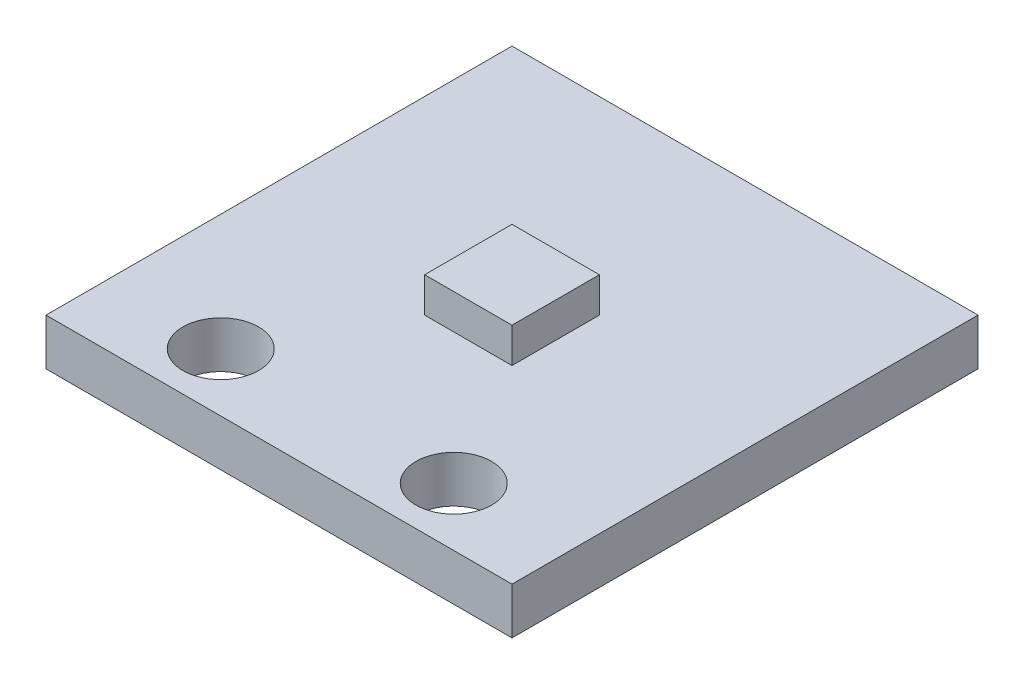
ISO-10303-21;
HEADER;
FILE_DESCRIPTION(('STEP AP214'),'2;1');
FILE_NAME('part.step','',(''),(''),'','','');
FILE_SCHEMA(('AUTOMOTIVE_DESIGN { 1 0 10303 214 1 1 1 1 }'));
ENDSEC;
DATA;
#1=APPLICATION_CONTEXT('core data for automotive mechanical design processes');
#2=APPLICATION_PROTOCOL_DEFINITION('international standard','automotive_design',2000,#1);
#3=PRODUCT_CONTEXT('',#1,'mechanical');
#4=PRODUCT('Part','Part','',(#3));
#5=PRODUCT_RELATED_PRODUCT_CATEGORY('part','',(#4));
#6=PRODUCT_DEFINITION_FORMATION('','',#4);
#7=PRODUCT_DEFINITION_CONTEXT('part definition',#1,'design');
#8=PRODUCT_DEFINITION('design','',#6,#7);
#9=PRODUCT_DEFINITION_SHAPE('','',#8);
#10=(LENGTH_UNIT() NAMED_UNIT(*) SI_UNIT(.MILLI.,.METRE.));
#11=(NAMED_UNIT(*) PLANE_ANGLE_UNIT() SI_UNIT($,.RADIAN.));
#12=(NAMED_UNIT(*) SI_UNIT($,.STERADIAN.) SOLID_ANGLE_UNIT());
#13=UNCERTAINTY_MEASURE_WITH_UNIT(LENGTH_MEASURE(1.E-05),#10,'distance_accuracy_value','');
#14=(GEOMETRIC_REPRESENTATION_CONTEXT(3) GLOBAL_UNCERTAINTY_ASSIGNED_CONTEXT((#13)) GLOBAL_UNIT_ASSIGNED_CONTEXT((#10,
#11,#12)) REPRESENTATION_CONTEXT('',''));
#15=CARTESIAN_POINT('',(0.,0.,0.));
#16=DIRECTION('',(0.,0.,1.));
#17=DIRECTION('',(1.,0.,0.));
#18=AXIS2_PLACEMENT_3D('',#15,#16,#17);
#19=CARTESIAN_POINT('',(-130.,132.4,70.));
#20=DIRECTION('',(1.,0.,0.));
#21=DIRECTION('',(0.,0.,-1.));
#22=AXIS2_PLACEMENT_3D('',#19,#20,#21);
#23=PLANE('',#22);
#24=DIRECTION('',(0.,-1.,0.));
#25=VECTOR('',#24,1.);
#26=CARTESIAN_POINT('',(-130.,132.4,54.));
#27=LINE('',#26,#25);
#28=CARTESIAN_POINT('',(-130.,134.,54.));
#29=VERTEX_POINT('',#28);
#30=CARTESIAN_POINT('',(-130.,132.4,54.));
#31=VERTEX_POINT('',#30);
#32=EDGE_CURVE('E130',#29,#31,#27,.T.);
#33=ORIENTED_EDGE('',*,*,#32,.T.);
#34=DIRECTION('',(0.,0.,-1.));
#35=VECTOR('',#34,1.);
#36=CARTESIAN_POINT('',(-130.,132.4,70.));
#37=LINE('',#36,#35);
#38=CARTESIAN_POINT('',(-130.,132.4,70.));
#39=VERTEX_POINT('',#38);
#40=EDGE_CURVE('E11',#39,#31,#37,.T.);
#41=ORIENTED_EDGE('',*,*,#40,.F.);
#42=DIRECTION('',(0.,-1.,0.));
#43=VECTOR('',#42,1.);
#44=CARTESIAN_POINT('',(-130.,132.4,70.));
#45=LINE('',#44,#43);
#46=CARTESIAN_POINT('',(-130.,134.,70.));
#47=VERTEX_POINT('',#46);
#48=EDGE_CURVE('E153',#47,#39,#45,.T.);
#49=ORIENTED_EDGE('',*,*,#48,.F.);
#50=DIRECTION('',(0.,0.,-1.));
#51=VECTOR('',#50,1.);
#52=CARTESIAN_POINT('',(-130.,134.,70.));
#53=LINE('',#52,#51);
#54=EDGE_CURVE('E159',#47,#29,#53,.T.);
#55=ORIENTED_EDGE('',*,*,#54,.T.);
#56=EDGE_LOOP('',(#33,#41,#49,#55));
#57=FACE_BOUND('',#56,.T.);
#58=ADVANCED_FACE('F41',(#57),#23,.F.);
#59=CARTESIAN_POINT('',(-130.,132.4,70.));
#60=DIRECTION('',(0.,1.,0.));
#61=DIRECTION('',(0.,0.,1.));
#62=AXIS2_PLACEMENT_3D('',#59,#60,#61);
#63=PLANE('',#62);
#64=CARTESIAN_POINT('',(-126.,132.4,68.));
#65=DIRECTION('',(0.,-1.,0.));
#66=DIRECTION('',(0.,0.,-1.));
#67=AXIS2_PLACEMENT_3D('',#64,#65,#66);
#68=CIRCLE('',#67,1.3);
#69=CARTESIAN_POINT('',(-126.,132.4,66.7));
#70=VERTEX_POINT('',#69);
#71=EDGE_CURVE('E206',#70,#70,#68,.T.);
#72=ORIENTED_EDGE('',*,*,#71,.F.);
#73=EDGE_LOOP('',(#72));
#74=FACE_BOUND('',#73,.T.);
#75=CARTESIAN_POINT('',(-118.,132.4,68.));
#76=DIRECTION('',(0.,-1.,0.));
#77=DIRECTION('',(0.,0.,-1.));
#78=AXIS2_PLACEMENT_3D('',#75,#76,#77);
#79=CIRCLE('',#78,1.3);
#80=CARTESIAN_POINT('',(-118.,132.4,66.7));
#81=VERTEX_POINT('',#80);
#82=EDGE_CURVE('E211',#81,#81,#79,.T.);
#83=ORIENTED_EDGE('',*,*,#82,.F.);
#84=EDGE_LOOP('',(#83));
#85=FACE_BOUND('',#84,.T.);
#86=DIRECTION('',(1.,0.,0.));
#87=VECTOR('',#86,1.);
#88=CARTESIAN_POINT('',(-130.,132.4,54.));
#89=LINE('',#88,#87);
#90=CARTESIAN_POINT('',(-114.,132.4,54.));
#91=VERTEX_POINT('',#90);
#92=EDGE_CURVE('E161',#31,#91,#89,.T.);
#93=ORIENTED_EDGE('',*,*,#92,.T.);
#94=DIRECTION('',(0.,0.,-1.));
#95=VECTOR('',#94,1.);
#96=CARTESIAN_POINT('',(-114.,132.4,70.));
#97=LINE('',#96,#95);
#98=CARTESIAN_POINT('',(-114.,132.4,70.));
#99=VERTEX_POINT('',#98);
#100=EDGE_CURVE('E48',#99,#91,#97,.T.);
#101=ORIENTED_EDGE('',*,*,#100,.F.);
#102=DIRECTION('',(1.,0.,0.));
#103=VECTOR('',#102,1.);
#104=CARTESIAN_POINT('',(-130.,132.4,70.));
#105=LINE('',#104,#103);
#106=EDGE_CURVE('E95',#39,#99,#105,.T.);
#107=ORIENTED_EDGE('',*,*,#106,.F.);
#108=ORIENTED_EDGE('',*,*,#40,.T.);
#109=EDGE_LOOP('',(#93,#101,#107,#108));
#110=FACE_BOUND('',#109,.T.);
#111=ADVANCED_FACE('F194',(#74,#85,#110),#63,.F.);
#112=CARTESIAN_POINT('',(-114.,132.4,70.));
#113=DIRECTION('',(-1.,0.,0.));
#114=DIRECTION('',(0.,0.,1.));
#115=AXIS2_PLACEMENT_3D('',#112,#113,#114);
#116=PLANE('',#115);
#117=DIRECTION('',(0.,1.,0.));
#118=VECTOR('',#117,1.);
#119=CARTESIAN_POINT('',(-114.,132.4,54.));
#120=LINE('',#119,#118);
#121=CARTESIAN_POINT('',(-114.,134.,54.));
#122=VERTEX_POINT('',#121);
#123=EDGE_CURVE('E164',#91,#122,#120,.T.);
#124=ORIENTED_EDGE('',*,*,#123,.T.);
#125=DIRECTION('',(0.,0.,-1.));
#126=VECTOR('',#125,1.);
#127=CARTESIAN_POINT('',(-114.,134.,70.));
#128=LINE('',#127,#126);
#129=CARTESIAN_POINT('',(-114.,134.,70.));
#130=VERTEX_POINT('',#129);
#131=EDGE_CURVE('E169',#130,#122,#128,.T.);
#132=ORIENTED_EDGE('',*,*,#131,.F.);
#133=DIRECTION('',(0.,1.,0.));
#134=VECTOR('',#133,1.);
#135=CARTESIAN_POINT('',(-114.,132.4,70.));
#136=LINE('',#135,#134);
#137=EDGE_CURVE('E160',#99,#130,#136,.T.);
#138=ORIENTED_EDGE('',*,*,#137,.F.);
#139=ORIENTED_EDGE('',*,*,#100,.T.);
#140=EDGE_LOOP('',(#124,#132,#138,#139));
#141=FACE_BOUND('',#140,.T.);
#142=ADVANCED_FACE('F172',(#141),#116,.F.);
#143=CARTESIAN_POINT('',(-130.,134.,70.));
#144=DIRECTION('',(0.,-1.,0.));
#145=DIRECTION('',(0.,0.,-1.));
#146=AXIS2_PLACEMENT_3D('',#143,#144,#145);
#147=PLANE('',#146);
#148=CARTESIAN_POINT('',(-126.,134.,68.));
#149=DIRECTION('',(0.,-1.,0.));
#150=DIRECTION('',(0.,0.,-1.));
#151=AXIS2_PLACEMENT_3D('',#148,#149,#150);
#152=CIRCLE('',#151,1.3);
#153=CARTESIAN_POINT('',(-126.,134.,66.7));
#154=VERTEX_POINT('',#153);
#155=EDGE_CURVE('E144',#154,#154,#152,.T.);
#156=ORIENTED_EDGE('',*,*,#155,.T.);
#157=EDGE_LOOP('',(#156));
#158=FACE_BOUND('',#157,.T.);
#159=CARTESIAN_POINT('',(-118.,134.,68.));
#160=DIRECTION('',(0.,-1.,0.));
#161=DIRECTION('',(0.,0.,-1.));
#162=AXIS2_PLACEMENT_3D('',#159,#160,#161);
#163=CIRCLE('',#162,1.3);
#164=CARTESIAN_POINT('',(-118.,134.,66.7));
#165=VERTEX_POINT('',#164);
#166=EDGE_CURVE('E214',#165,#165,#163,.T.);
#167=ORIENTED_EDGE('',*,*,#166,.T.);
#168=EDGE_LOOP('',(#167));
#169=FACE_BOUND('',#168,.T.);
#170=DIRECTION('',(0.,0.,-1.));
#171=VECTOR('',#170,1.);
#172=CARTESIAN_POINT('',(-123.5,134.,63.5));
#173=LINE('',#172,#171);
#174=CARTESIAN_POINT('',(-123.5,134.,63.5));
#175=VERTEX_POINT('',#174);
#176=CARTESIAN_POINT('',(-123.5,134.,60.5));
#177=VERTEX_POINT('',#176);
#178=EDGE_CURVE('E126',#175,#177,#173,.T.);
#179=ORIENTED_EDGE('',*,*,#178,.T.);
#180=DIRECTION('',(1.,0.,0.));
#181=VECTOR('',#180,1.);
#182=CARTESIAN_POINT('',(-123.5,134.,60.5));
#183=LINE('',#182,#181);
#184=CARTESIAN_POINT('',(-120.5,134.,60.5));
#185=VERTEX_POINT('',#184);
#186=EDGE_CURVE('E141',#177,#185,#183,.T.);
#187=ORIENTED_EDGE('',*,*,#186,.T.);
#188=DIRECTION('',(0.,0.,-1.));
#189=VECTOR('',#188,1.);
#190=CARTESIAN_POINT('',(-120.5,134.,63.5));
#191=LINE('',#190,#189);
#192=CARTESIAN_POINT('',(-120.5,134.,63.5));
#193=VERTEX_POINT('',#192);
#194=EDGE_CURVE('E134',#193,#185,#191,.T.);
#195=ORIENTED_EDGE('',*,*,#194,.F.);
#196=DIRECTION('',(1.,0.,0.));
#197=VECTOR('',#196,1.);
#198=CARTESIAN_POINT('',(-123.5,134.,63.5));
#199=LINE('',#198,#197);
#200=EDGE_CURVE('E117',#175,#193,#199,.T.);
#201=ORIENTED_EDGE('',*,*,#200,.F.);
#202=EDGE_LOOP('',(#179,#187,#195,#201));
#203=FACE_BOUND('',#202,.T.);
#204=DIRECTION('',(-1.,0.,0.));
#205=VECTOR('',#204,1.);
#206=CARTESIAN_POINT('',(-130.,134.,54.));
#207=LINE('',#206,#205);
#208=EDGE_CURVE('E85',#122,#29,#207,.T.);
#209=ORIENTED_EDGE('',*,*,#208,.T.);
#210=ORIENTED_EDGE('',*,*,#54,.F.);
#211=DIRECTION('',(-1.,0.,0.));
#212=VECTOR('',#211,1.);
#213=CARTESIAN_POINT('',(-130.,134.,70.));
#214=LINE('',#213,#212);
#215=EDGE_CURVE('E63',#130,#47,#214,.T.);
#216=ORIENTED_EDGE('',*,*,#215,.F.);
#217=ORIENTED_EDGE('',*,*,#131,.T.);
#218=EDGE_LOOP('',(#209,#210,#216,#217));
#219=FACE_BOUND('',#218,.T.);
#220=ADVANCED_FACE('F133',(#158,#169,#203,#219),#147,.F.);
#221=CARTESIAN_POINT('',(0.,0.,70.));
#222=DIRECTION('',(0.,0.,-1.));
#223=DIRECTION('',(-1.,0.,0.));
#224=AXIS2_PLACEMENT_3D('',#221,#222,#223);
#225=PLANE('',#224);
#226=ORIENTED_EDGE('',*,*,#48,.T.);
#227=ORIENTED_EDGE('',*,*,#106,.T.);
#228=ORIENTED_EDGE('',*,*,#137,.T.);
#229=ORIENTED_EDGE('',*,*,#215,.T.);
#230=EDGE_LOOP('',(#226,#227,#228,#229));
#231=FACE_BOUND('',#230,.T.);
#232=ADVANCED_FACE('F182',(#231),#225,.F.);
#233=CARTESIAN_POINT('',(0.,0.,54.));
#234=DIRECTION('',(0.,0.,-1.));
#235=DIRECTION('',(-1.,0.,0.));
#236=AXIS2_PLACEMENT_3D('',#233,#234,#235);
#237=PLANE('',#236);
#238=ORIENTED_EDGE('',*,*,#32,.F.);
#239=ORIENTED_EDGE('',*,*,#208,.F.);
#240=ORIENTED_EDGE('',*,*,#123,.F.);
#241=ORIENTED_EDGE('',*,*,#92,.F.);
#242=EDGE_LOOP('',(#238,#239,#240,#241));
#243=FACE_BOUND('',#242,.T.);
#244=ADVANCED_FACE('F178',(#243),#237,.T.);
#245=CARTESIAN_POINT('',(-123.5,134.,63.5));
#246=DIRECTION('',(1.,0.,0.));
#247=DIRECTION('',(0.,0.,-1.));
#248=AXIS2_PLACEMENT_3D('',#245,#246,#247);
#249=PLANE('',#248);
#250=DIRECTION('',(0.,-1.,0.));
#251=VECTOR('',#250,1.);
#252=CARTESIAN_POINT('',(-123.5,134.,60.5));
#253=LINE('',#252,#251);
#254=CARTESIAN_POINT('',(-123.5,135.2,60.5));
#255=VERTEX_POINT('',#254);
#256=EDGE_CURVE('E54',#255,#177,#253,.T.);
#257=ORIENTED_EDGE('',*,*,#256,.T.);
#258=ORIENTED_EDGE('',*,*,#178,.F.);
#259=DIRECTION('',(0.,-1.,0.));
#260=VECTOR('',#259,1.);
#261=CARTESIAN_POINT('',(-123.5,134.,63.5));
#262=LINE('',#261,#260);
#263=CARTESIAN_POINT('',(-123.5,135.2,63.5));
#264=VERTEX_POINT('',#263);
#265=EDGE_CURVE('E114',#264,#175,#262,.T.);
#266=ORIENTED_EDGE('',*,*,#265,.F.);
#267=DIRECTION('',(0.,0.,-1.));
#268=VECTOR('',#267,1.);
#269=CARTESIAN_POINT('',(-123.5,135.2,63.5));
#270=LINE('',#269,#268);
#271=EDGE_CURVE('E142',#264,#255,#270,.T.);
#272=ORIENTED_EDGE('',*,*,#271,.T.);
#273=EDGE_LOOP('',(#257,#258,#266,#272));
#274=FACE_BOUND('',#273,.T.);
#275=ADVANCED_FACE('F127',(#274),#249,.F.);
#276=CARTESIAN_POINT('',(-120.5,134.,63.5));
#277=DIRECTION('',(-1.,0.,0.));
#278=DIRECTION('',(0.,0.,1.));
#279=AXIS2_PLACEMENT_3D('',#276,#277,#278);
#280=PLANE('',#279);
#281=DIRECTION('',(0.,1.,0.));
#282=VECTOR('',#281,1.);
#283=CARTESIAN_POINT('',(-120.5,134.,60.5));
#284=LINE('',#283,#282);
#285=CARTESIAN_POINT('',(-120.5,135.2,60.5));
#286=VERTEX_POINT('',#285);
#287=EDGE_CURVE('E146',#185,#286,#284,.T.);
#288=ORIENTED_EDGE('',*,*,#287,.T.);
#289=DIRECTION('',(0.,0.,-1.));
#290=VECTOR('',#289,1.);
#291=CARTESIAN_POINT('',(-120.5,135.2,63.5));
#292=LINE('',#291,#290);
#293=CARTESIAN_POINT('',(-120.5,135.2,63.5));
#294=VERTEX_POINT('',#293);
#295=EDGE_CURVE('E150',#294,#286,#292,.T.);
#296=ORIENTED_EDGE('',*,*,#295,.F.);
#297=DIRECTION('',(0.,1.,0.));
#298=VECTOR('',#297,1.);
#299=CARTESIAN_POINT('',(-120.5,134.,63.5));
#300=LINE('',#299,#298);
#301=EDGE_CURVE('E132',#193,#294,#300,.T.);
#302=ORIENTED_EDGE('',*,*,#301,.F.);
#303=ORIENTED_EDGE('',*,*,#194,.T.);
#304=EDGE_LOOP('',(#288,#296,#302,#303));
#305=FACE_BOUND('',#304,.T.);
#306=ADVANCED_FACE('F238',(#305),#280,.F.);
#307=CARTESIAN_POINT('',(-123.5,135.2,63.5));
#308=DIRECTION('',(0.,-1.,0.));
#309=DIRECTION('',(0.,0.,-1.));
#310=AXIS2_PLACEMENT_3D('',#307,#308,#309);
#311=PLANE('',#310);
#312=DIRECTION('',(-1.,0.,0.));
#313=VECTOR('',#312,1.);
#314=CARTESIAN_POINT('',(-123.5,135.2,60.5));
#315=LINE('',#314,#313);
#316=EDGE_CURVE('E124',#286,#255,#315,.T.);
#317=ORIENTED_EDGE('',*,*,#316,.T.);
#318=ORIENTED_EDGE('',*,*,#271,.F.);
#319=DIRECTION('',(-1.,0.,0.));
#320=VECTOR('',#319,1.);
#321=CARTESIAN_POINT('',(-123.5,135.2,63.5));
#322=LINE('',#321,#320);
#323=EDGE_CURVE('E122',#294,#264,#322,.T.);
#324=ORIENTED_EDGE('',*,*,#323,.F.);
#325=ORIENTED_EDGE('',*,*,#295,.T.);
#326=EDGE_LOOP('',(#317,#318,#324,#325));
#327=FACE_BOUND('',#326,.T.);
#328=ADVANCED_FACE('F231',(#327),#311,.F.);
#329=CARTESIAN_POINT('',(0.,0.,63.5));
#330=DIRECTION('',(0.,0.,-1.));
#331=DIRECTION('',(-1.,0.,0.));
#332=AXIS2_PLACEMENT_3D('',#329,#330,#331);
#333=PLANE('',#332);
#334=ORIENTED_EDGE('',*,*,#265,.T.);
#335=ORIENTED_EDGE('',*,*,#200,.T.);
#336=ORIENTED_EDGE('',*,*,#301,.T.);
#337=ORIENTED_EDGE('',*,*,#323,.T.);
#338=EDGE_LOOP('',(#334,#335,#336,#337));
#339=FACE_BOUND('',#338,.T.);
#340=ADVANCED_FACE('F116',(#339),#333,.F.);
#341=CARTESIAN_POINT('',(0.,0.,60.5));
#342=DIRECTION('',(0.,0.,-1.));
#343=DIRECTION('',(-1.,0.,0.));
#344=AXIS2_PLACEMENT_3D('',#341,#342,#343);
#345=PLANE('',#344);
#346=ORIENTED_EDGE('',*,*,#256,.F.);
#347=ORIENTED_EDGE('',*,*,#316,.F.);
#348=ORIENTED_EDGE('',*,*,#287,.F.);
#349=ORIENTED_EDGE('',*,*,#186,.F.);
#350=EDGE_LOOP('',(#346,#347,#348,#349));
#351=FACE_BOUND('',#350,.T.);
#352=ADVANCED_FACE('F227',(#351),#345,.T.);
#353=CARTESIAN_POINT('',(-118.,134.,68.));
#354=DIRECTION('',(0.,-1.,0.));
#355=DIRECTION('',(0.,0.,-1.));
#356=AXIS2_PLACEMENT_3D('',#353,#354,#355);
#357=CYLINDRICAL_SURFACE('',#356,1.3);
#358=ORIENTED_EDGE('',*,*,#166,.F.);
#359=EDGE_LOOP('',(#358));
#360=FACE_BOUND('',#359,.T.);
#361=ORIENTED_EDGE('',*,*,#82,.T.);
#362=EDGE_LOOP('',(#361));
#363=FACE_BOUND('',#362,.T.);
#364=ADVANCED_FACE('F222',(#360,#363),#357,.F.);
#365=CARTESIAN_POINT('',(-126.,134.,68.));
#366=DIRECTION('',(0.,-1.,0.));
#367=DIRECTION('',(0.,0.,-1.));
#368=AXIS2_PLACEMENT_3D('',#365,#366,#367);
#369=CYLINDRICAL_SURFACE('',#368,1.3);
#370=ORIENTED_EDGE('',*,*,#155,.F.);
#371=EDGE_LOOP('',(#370));
#372=FACE_BOUND('',#371,.T.);
#373=ORIENTED_EDGE('',*,*,#71,.T.);
#374=EDGE_LOOP('',(#373));
#375=FACE_BOUND('',#374,.T.);
#376=ADVANCED_FACE('F217',(#372,#375),#369,.F.);
#377=CLOSED_SHELL('',(#58,#111,#142,#220,#232,#244,#275,#306,#328,#340,#352,#364,#376));
#378=MANIFOLD_SOLID_BREP('B2',#377);
#379=ADVANCED_BREP_SHAPE_REPRESENTATION('',(#18,#378),#14);
#380=SHAPE_DEFINITION_REPRESENTATION(#9,#379);
ENDSEC;
END-ISO-10303-21;
